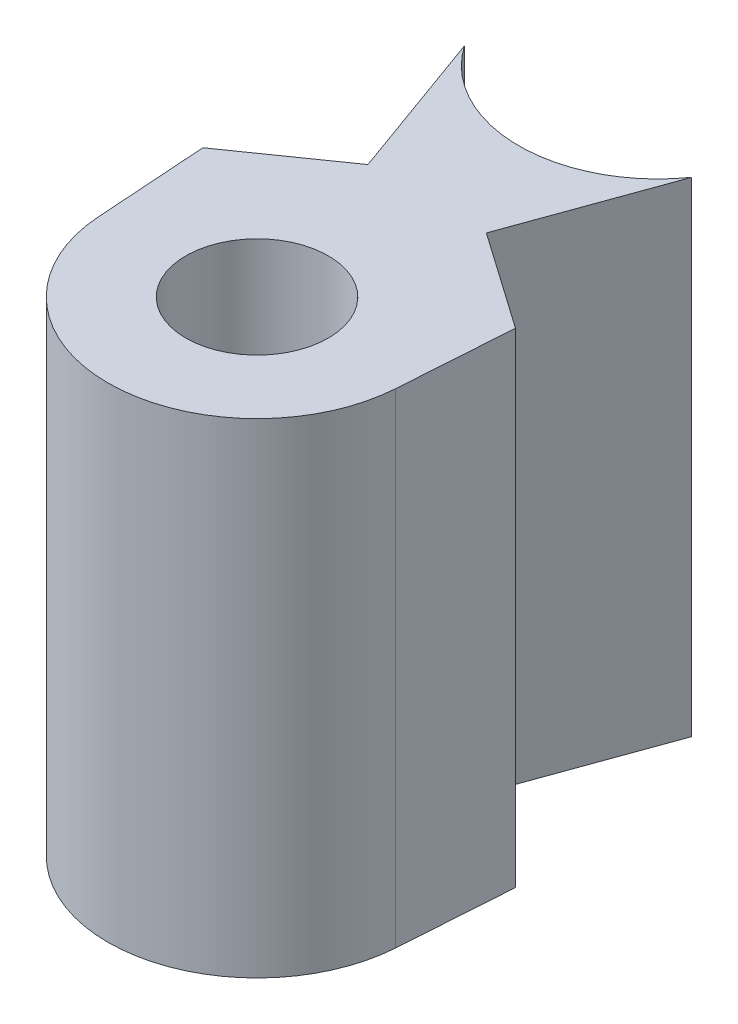
ISO-10303-21;
HEADER;
FILE_DESCRIPTION(('STEP AP214'),'2;1');
FILE_NAME('part.step','',(''),(''),'','','');
FILE_SCHEMA(('AUTOMOTIVE_DESIGN { 1 0 10303 214 1 1 1 1 }'));
ENDSEC;
DATA;
#1=APPLICATION_CONTEXT('core data for automotive mechanical design processes');
#2=APPLICATION_PROTOCOL_DEFINITION('international standard','automotive_design',2000,#1);
#3=PRODUCT_CONTEXT('',#1,'mechanical');
#4=PRODUCT('Part','Part','',(#3));
#5=PRODUCT_RELATED_PRODUCT_CATEGORY('part','',(#4));
#6=PRODUCT_DEFINITION_FORMATION('','',#4);
#7=PRODUCT_DEFINITION_CONTEXT('part definition',#1,'design');
#8=PRODUCT_DEFINITION('design','',#6,#7);
#9=PRODUCT_DEFINITION_SHAPE('','',#8);
#10=(LENGTH_UNIT() NAMED_UNIT(*) SI_UNIT(.MILLI.,.METRE.));
#11=(NAMED_UNIT(*) PLANE_ANGLE_UNIT() SI_UNIT($,.RADIAN.));
#12=(NAMED_UNIT(*) SI_UNIT($,.STERADIAN.) SOLID_ANGLE_UNIT());
#13=UNCERTAINTY_MEASURE_WITH_UNIT(LENGTH_MEASURE(1.E-05),#10,'distance_accuracy_value','');
#14=(GEOMETRIC_REPRESENTATION_CONTEXT(3) GLOBAL_UNCERTAINTY_ASSIGNED_CONTEXT((#13)) GLOBAL_UNIT_ASSIGNED_CONTEXT((#10,
#11,#12)) REPRESENTATION_CONTEXT('',''));
#15=CARTESIAN_POINT('',(0.,0.,0.));
#16=DIRECTION('',(0.,0.,1.));
#17=DIRECTION('',(1.,0.,0.));
#18=AXIS2_PLACEMENT_3D('',#15,#16,#17);
#19=CARTESIAN_POINT('',(0.,1.75,0.));
#20=DIRECTION('',(-0.573576436351044,0.,0.819152044288993));
#21=DIRECTION('',(0.819152044288993,0.,0.573576436351044));
#22=AXIS2_PLACEMENT_3D('',#19,#20,#21);
#23=PLANE('',#22);
#24=DIRECTION('',(0.,-1.,0.));
#25=VECTOR('',#24,1.);
#26=CARTESIAN_POINT('',(0.6102682729953,1.75,0.427314445081528));
#27=LINE('',#26,#25);
#28=CARTESIAN_POINT('',(0.6102682729953,1.75,0.427314445081528));
#29=VERTEX_POINT('',#28);
#30=CARTESIAN_POINT('',(0.6102682729953,0.85,0.427314445081528));
#31=VERTEX_POINT('',#30);
#32=EDGE_CURVE('E44',#29,#31,#27,.T.);
#33=ORIENTED_EDGE('',*,*,#32,.T.);
#34=DIRECTION('',(-0.819152044288993,0.,-0.573576436351044));
#35=VECTOR('',#34,1.);
#36=CARTESIAN_POINT('',(0.,0.85,0.));
#37=LINE('',#36,#35);
#38=CARTESIAN_POINT('',(0.479203945909061,0.85,0.335542215265361));
#39=VERTEX_POINT('',#38);
#40=EDGE_CURVE('E154',#31,#39,#37,.T.);
#41=ORIENTED_EDGE('',*,*,#40,.T.);
#42=DIRECTION('',(0.,-1.,0.));
#43=VECTOR('',#42,1.);
#44=CARTESIAN_POINT('',(0.479203945909061,1.75,0.335542215265361));
#45=LINE('',#44,#43);
#46=CARTESIAN_POINT('',(0.479203945909061,1.75,0.335542215265361));
#47=VERTEX_POINT('',#46);
#48=EDGE_CURVE('E11',#47,#39,#45,.T.);
#49=ORIENTED_EDGE('',*,*,#48,.F.);
#50=DIRECTION('',(-0.819152044288993,0.,-0.573576436351044));
#51=VECTOR('',#50,1.);
#52=CARTESIAN_POINT('',(0.,1.75,0.));
#53=LINE('',#52,#51);
#54=EDGE_CURVE('E170',#29,#47,#53,.T.);
#55=ORIENTED_EDGE('',*,*,#54,.F.);
#56=EDGE_LOOP('',(#33,#41,#49,#55));
#57=FACE_BOUND('',#56,.T.);
#58=ADVANCED_FACE('F41',(#57),#23,.F.);
#59=CARTESIAN_POINT('',(0.,1.75,0.));
#60=DIRECTION('',(0.,-1.,0.));
#61=DIRECTION('',(0.,0.,-1.));
#62=AXIS2_PLACEMENT_3D('',#59,#60,#61);
#63=CYLINDRICAL_SURFACE('',#62,0.585);
#64=ORIENTED_EDGE('',*,*,#48,.T.);
#65=CARTESIAN_POINT('',(0.,0.85,0.));
#66=DIRECTION('',(0.,-1.,0.));
#67=DIRECTION('',(0.,0.,-1.));
#68=AXIS2_PLACEMENT_3D('',#65,#66,#67);
#69=CIRCLE('',#68,0.585);
#70=CARTESIAN_POINT('',(-0.479203945909061,0.85,0.335542215265361));
#71=VERTEX_POINT('',#70);
#72=EDGE_CURVE('E167',#39,#71,#69,.T.);
#73=ORIENTED_EDGE('',*,*,#72,.T.);
#74=DIRECTION('',(0.,-1.,0.));
#75=VECTOR('',#74,1.);
#76=CARTESIAN_POINT('',(-0.479203945909061,1.75,0.335542215265361));
#77=LINE('',#76,#75);
#78=CARTESIAN_POINT('',(-0.479203945909061,1.75,0.335542215265361));
#79=VERTEX_POINT('',#78);
#80=EDGE_CURVE('E49',#79,#71,#77,.T.);
#81=ORIENTED_EDGE('',*,*,#80,.F.);
#82=CARTESIAN_POINT('',(0.,1.75,0.));
#83=DIRECTION('',(0.,-1.,0.));
#84=DIRECTION('',(0.,0.,-1.));
#85=AXIS2_PLACEMENT_3D('',#82,#83,#84);
#86=CIRCLE('',#85,0.585);
#87=EDGE_CURVE('E56',#47,#79,#86,.T.);
#88=ORIENTED_EDGE('',*,*,#87,.F.);
#89=EDGE_LOOP('',(#64,#73,#81,#88));
#90=FACE_BOUND('',#89,.T.);
#91=ADVANCED_FACE('F276',(#90),#63,.F.);
#92=CARTESIAN_POINT('',(0.,1.75,0.));
#93=DIRECTION('',(0.573576436351044,0.,0.819152044288993));
#94=DIRECTION('',(0.819152044288993,0.,-0.573576436351044));
#95=AXIS2_PLACEMENT_3D('',#92,#93,#94);
#96=PLANE('',#95);
#97=ORIENTED_EDGE('',*,*,#80,.T.);
#98=DIRECTION('',(-0.819152044288993,0.,0.573576436351044));
#99=VECTOR('',#98,1.);
#100=CARTESIAN_POINT('',(0.,0.85,0.));
#101=LINE('',#100,#99);
#102=CARTESIAN_POINT('',(-0.6102682729953,0.85,0.427314445081528));
#103=VERTEX_POINT('',#102);
#104=EDGE_CURVE('E164',#71,#103,#101,.T.);
#105=ORIENTED_EDGE('',*,*,#104,.T.);
#106=DIRECTION('',(0.,-1.,0.));
#107=VECTOR('',#106,1.);
#108=CARTESIAN_POINT('',(-0.6102682729953,1.75,0.427314445081528));
#109=LINE('',#108,#107);
#110=CARTESIAN_POINT('',(-0.6102682729953,1.75,0.427314445081528));
#111=VERTEX_POINT('',#110);
#112=EDGE_CURVE('E178',#111,#103,#109,.T.);
#113=ORIENTED_EDGE('',*,*,#112,.F.);
#114=DIRECTION('',(-0.819152044288993,0.,0.573576436351044));
#115=VECTOR('',#114,1.);
#116=CARTESIAN_POINT('',(0.,1.75,0.));
#117=LINE('',#116,#115);
#118=EDGE_CURVE('E175',#79,#111,#117,.T.);
#119=ORIENTED_EDGE('',*,*,#118,.F.);
#120=EDGE_LOOP('',(#97,#105,#113,#119));
#121=FACE_BOUND('',#120,.T.);
#122=ADVANCED_FACE('F280',(#121),#96,.F.);
#123=CARTESIAN_POINT('',(0.,1.75,0.));
#124=DIRECTION('',(0.,-1.,0.));
#125=DIRECTION('',(0.,0.,-1.));
#126=AXIS2_PLACEMENT_3D('',#123,#124,#125);
#127=PLANE('',#126);
#128=ORIENTED_EDGE('',*,*,#54,.T.);
#129=ORIENTED_EDGE('',*,*,#87,.T.);
#130=ORIENTED_EDGE('',*,*,#118,.T.);
#131=CARTESIAN_POINT('',(0.,1.75,0.));
#132=DIRECTION('',(0.,-1.,0.));
#133=DIRECTION('',(0.,0.,-1.));
#134=AXIS2_PLACEMENT_3D('',#131,#132,#133);
#135=CIRCLE('',#134,0.745);
#136=EDGE_CURVE('E172',#29,#111,#135,.T.);
#137=ORIENTED_EDGE('',*,*,#136,.F.);
#138=EDGE_LOOP('',(#128,#129,#130,#137));
#139=FACE_BOUND('',#138,.T.);
#140=ADVANCED_FACE('F285',(#139),#127,.F.);
#141=CARTESIAN_POINT('',(0.,0.85,0.));
#142=DIRECTION('',(0.,-1.,0.));
#143=DIRECTION('',(0.,0.,-1.));
#144=AXIS2_PLACEMENT_3D('',#141,#142,#143);
#145=PLANE('',#144);
#146=ORIENTED_EDGE('',*,*,#40,.F.);
#147=CARTESIAN_POINT('',(0.,0.85,0.));
#148=DIRECTION('',(0.,-1.,0.));
#149=DIRECTION('',(0.,0.,-1.));
#150=AXIS2_PLACEMENT_3D('',#147,#148,#149);
#151=CIRCLE('',#150,0.745);
#152=EDGE_CURVE('E157',#31,#103,#151,.T.);
#153=ORIENTED_EDGE('',*,*,#152,.T.);
#154=ORIENTED_EDGE('',*,*,#104,.F.);
#155=ORIENTED_EDGE('',*,*,#72,.F.);
#156=EDGE_LOOP('',(#146,#153,#154,#155));
#157=FACE_BOUND('',#156,.T.);
#158=ADVANCED_FACE('F193',(#157),#145,.T.);
#159=CARTESIAN_POINT('',(0.,2.6,0.));
#160=DIRECTION('',(0.,-1.,0.));
#161=DIRECTION('',(0.,0.,-1.));
#162=AXIS2_PLACEMENT_3D('',#159,#160,#161);
#163=CYLINDRICAL_SURFACE('',#162,0.745);
#164=ORIENTED_EDGE('',*,*,#152,.F.);
#165=DIRECTION('',(0.,-1.,0.));
#166=VECTOR('',#165,1.);
#167=CARTESIAN_POINT('',(0.6102682729953,2.6,0.427314445081528));
#168=LINE('',#167,#166);
#169=CARTESIAN_POINT('',(0.6102682729953,0.,0.427314445081528));
#170=VERTEX_POINT('',#169);
#171=EDGE_CURVE('E199',#31,#170,#168,.T.);
#172=ORIENTED_EDGE('',*,*,#171,.T.);
#173=CARTESIAN_POINT('',(0.,0.,0.));
#174=DIRECTION('',(0.,1.,0.));
#175=DIRECTION('',(0.,0.,1.));
#176=AXIS2_PLACEMENT_3D('',#173,#174,#175);
#177=CIRCLE('',#176,0.745);
#178=CARTESIAN_POINT('',(-0.6102682729953,0.,0.427314445081528));
#179=VERTEX_POINT('',#178);
#180=EDGE_CURVE('E231',#179,#170,#177,.T.);
#181=ORIENTED_EDGE('',*,*,#180,.F.);
#182=DIRECTION('',(0.,-1.,0.));
#183=VECTOR('',#182,1.);
#184=CARTESIAN_POINT('',(-0.6102682729953,2.6,0.427314445081528));
#185=LINE('',#184,#183);
#186=EDGE_CURVE('E201',#103,#179,#185,.T.);
#187=ORIENTED_EDGE('',*,*,#186,.F.);
#188=EDGE_LOOP('',(#164,#172,#181,#187));
#189=FACE_BOUND('',#188,.T.);
#190=ADVANCED_FACE('F197',(#189),#163,.F.);
#191=CARTESIAN_POINT('',(-0.942848429511865,2.6,0.0637325581395349));
#192=DIRECTION('',(0.997723205832662,0.,-0.0674418604651163));
#193=DIRECTION('',(-0.0674418604651162,0.,-0.997723205832662));
#194=AXIS2_PLACEMENT_3D('',#191,#192,#193);
#195=PLANE('',#194);
#196=DIRECTION('',(0.0674418604651163,0.,0.997723205832662));
#197=VECTOR('',#196,1.);
#198=CARTESIAN_POINT('',(-0.942848429511865,0.,0.0637325581395349));
#199=LINE('',#198,#197);
#200=CARTESIAN_POINT('',(-0.838876724693396,0.,1.60187195601434));
#201=VERTEX_POINT('',#200);
#202=CARTESIAN_POINT('',(-0.79817856466613,0.,2.20395348837209));
#203=VERTEX_POINT('',#202);
#204=EDGE_CURVE('E153',#201,#203,#199,.T.);
#205=ORIENTED_EDGE('',*,*,#204,.T.);
#206=DIRECTION('',(0.,-1.,0.));
#207=VECTOR('',#206,1.);
#208=CARTESIAN_POINT('',(-0.79817856466613,2.6,2.20395348837209));
#209=LINE('',#208,#207);
#210=CARTESIAN_POINT('',(-0.79817856466613,2.6,2.20395348837209));
#211=VERTEX_POINT('',#210);
#212=EDGE_CURVE('E133',#211,#203,#209,.T.);
#213=ORIENTED_EDGE('',*,*,#212,.F.);
#214=DIRECTION('',(0.0674418604651163,0.,0.997723205832662));
#215=VECTOR('',#214,1.);
#216=CARTESIAN_POINT('',(-0.942848429511865,2.6,0.0637325581395349));
#217=LINE('',#216,#215);
#218=CARTESIAN_POINT('',(-0.838876724693396,2.6,1.60187195601434));
#219=VERTEX_POINT('',#218);
#220=EDGE_CURVE('E140',#219,#211,#217,.T.);
#221=ORIENTED_EDGE('',*,*,#220,.F.);
#222=DIRECTION('',(0.,-1.,0.));
#223=VECTOR('',#222,1.);
#224=CARTESIAN_POINT('',(-0.838876724693396,2.6,1.60187195601434));
#225=LINE('',#224,#223);
#226=EDGE_CURVE('E240',#219,#201,#225,.T.);
#227=ORIENTED_EDGE('',*,*,#226,.T.);
#228=EDGE_LOOP('',(#205,#213,#221,#227));
#229=FACE_BOUND('',#228,.T.);
#230=ADVANCED_FACE('F151',(#229),#195,.F.);
#231=CARTESIAN_POINT('',(0.,2.6,2.15));
#232=DIRECTION('',(0.,-1.,0.));
#233=DIRECTION('',(0.,0.,-1.));
#234=AXIS2_PLACEMENT_3D('',#231,#232,#233);
#235=CYLINDRICAL_SURFACE('',#234,0.8);
#236=CARTESIAN_POINT('',(0.,0.,2.15));
#237=DIRECTION('',(0.,1.,0.));
#238=DIRECTION('',(0.,0.,1.));
#239=AXIS2_PLACEMENT_3D('',#236,#237,#238);
#240=CIRCLE('',#239,0.8);
#241=CARTESIAN_POINT('',(0.79817856466613,0.,2.20395348837209));
#242=VERTEX_POINT('',#241);
#243=EDGE_CURVE('E227',#203,#242,#240,.T.);
#244=ORIENTED_EDGE('',*,*,#243,.T.);
#245=DIRECTION('',(0.,-1.,0.));
#246=VECTOR('',#245,1.);
#247=CARTESIAN_POINT('',(0.79817856466613,2.6,2.20395348837209));
#248=LINE('',#247,#246);
#249=CARTESIAN_POINT('',(0.79817856466613,2.6,2.20395348837209));
#250=VERTEX_POINT('',#249);
#251=EDGE_CURVE('E135',#250,#242,#248,.T.);
#252=ORIENTED_EDGE('',*,*,#251,.F.);
#253=CARTESIAN_POINT('',(0.,2.6,2.15));
#254=DIRECTION('',(0.,1.,0.));
#255=DIRECTION('',(0.,0.,1.));
#256=AXIS2_PLACEMENT_3D('',#253,#254,#255);
#257=CIRCLE('',#256,0.8);
#258=EDGE_CURVE('E128',#211,#250,#257,.T.);
#259=ORIENTED_EDGE('',*,*,#258,.F.);
#260=ORIENTED_EDGE('',*,*,#212,.T.);
#261=EDGE_LOOP('',(#244,#252,#259,#260));
#262=FACE_BOUND('',#261,.T.);
#263=ADVANCED_FACE('F131',(#262),#235,.T.);
#264=CARTESIAN_POINT('',(0.942848429511865,2.6,0.0637325581395349));
#265=DIRECTION('',(0.997723205832662,0.,0.0674418604651163));
#266=DIRECTION('',(0.0674418604651162,0.,-0.997723205832662));
#267=AXIS2_PLACEMENT_3D('',#264,#265,#266);
#268=PLANE('',#267);
#269=DIRECTION('',(-0.0674418604651163,0.,0.997723205832662));
#270=VECTOR('',#269,1.);
#271=CARTESIAN_POINT('',(0.942848429511865,0.,0.0637325581395349));
#272=LINE('',#271,#270);
#273=CARTESIAN_POINT('',(0.838876724693396,0.,1.60187195601434));
#274=VERTEX_POINT('',#273);
#275=EDGE_CURVE('E224',#274,#242,#272,.T.);
#276=ORIENTED_EDGE('',*,*,#275,.F.);
#277=DIRECTION('',(0.,-1.,0.));
#278=VECTOR('',#277,1.);
#279=CARTESIAN_POINT('',(0.838876724693396,2.6,1.60187195601434));
#280=LINE('',#279,#278);
#281=CARTESIAN_POINT('',(0.838876724693396,2.6,1.60187195601434));
#282=VERTEX_POINT('',#281);
#283=EDGE_CURVE('E159',#282,#274,#280,.T.);
#284=ORIENTED_EDGE('',*,*,#283,.F.);
#285=DIRECTION('',(-0.0674418604651163,0.,0.997723205832662));
#286=VECTOR('',#285,1.);
#287=CARTESIAN_POINT('',(0.942848429511865,2.6,0.0637325581395349));
#288=LINE('',#287,#286);
#289=EDGE_CURVE('E139',#282,#250,#288,.T.);
#290=ORIENTED_EDGE('',*,*,#289,.T.);
#291=ORIENTED_EDGE('',*,*,#251,.T.);
#292=EDGE_LOOP('',(#276,#284,#290,#291));
#293=FACE_BOUND('',#292,.T.);
#294=ADVANCED_FACE('F225',(#293),#268,.T.);
#295=CARTESIAN_POINT('',(-0.476651634714688,2.6,0.680729082028155));
#296=DIRECTION('',(0.573576436351044,0.,-0.819152044288993));
#297=DIRECTION('',(-0.819152044288993,0.,-0.573576436351044));
#298=AXIS2_PLACEMENT_3D('',#295,#296,#297);
#299=PLANE('',#298);
#300=DIRECTION('',(0.819152044288993,0.,0.573576436351044));
#301=VECTOR('',#300,1.);
#302=CARTESIAN_POINT('',(-0.476651634714688,0.,0.680729082028155));
#303=LINE('',#302,#301);
#304=CARTESIAN_POINT('',(0.317859347068842,0.,1.23705166066338));
#305=VERTEX_POINT('',#304);
#306=EDGE_CURVE('E219',#305,#274,#303,.T.);
#307=ORIENTED_EDGE('',*,*,#306,.F.);
#308=DIRECTION('',(0.,-1.,0.));
#309=VECTOR('',#308,1.);
#310=CARTESIAN_POINT('',(0.317859347068842,2.6,1.23705166066338));
#311=LINE('',#310,#309);
#312=CARTESIAN_POINT('',(0.317859347068842,2.6,1.23705166066338));
#313=VERTEX_POINT('',#312);
#314=EDGE_CURVE('E209',#313,#305,#311,.T.);
#315=ORIENTED_EDGE('',*,*,#314,.F.);
#316=DIRECTION('',(0.819152044288993,0.,0.573576436351044));
#317=VECTOR('',#316,1.);
#318=CARTESIAN_POINT('',(-0.476651634714688,2.6,0.680729082028155));
#319=LINE('',#318,#317);
#320=EDGE_CURVE('E221',#313,#282,#319,.T.);
#321=ORIENTED_EDGE('',*,*,#320,.T.);
#322=ORIENTED_EDGE('',*,*,#283,.T.);
#323=EDGE_LOOP('',(#307,#315,#321,#322));
#324=FACE_BOUND('',#323,.T.);
#325=ADVANCED_FACE('F217',(#324),#299,.T.);
#326=CARTESIAN_POINT('',(0.676375746077062,2.6,0.244249988301432));
#327=DIRECTION('',(0.94055248211324,0.,0.339648389353789));
#328=DIRECTION('',(0.339648389353789,0.,-0.94055248211324));
#329=AXIS2_PLACEMENT_3D('',#326,#327,#328);
#330=PLANE('',#329);
#331=DIRECTION('',(-0.339648389353789,0.,0.94055248211324));
#332=VECTOR('',#331,1.);
#333=CARTESIAN_POINT('',(0.676375746077062,0.,0.244249988301432));
#334=LINE('',#333,#332);
#335=EDGE_CURVE('E204',#170,#305,#334,.T.);
#336=ORIENTED_EDGE('',*,*,#335,.F.);
#337=ORIENTED_EDGE('',*,*,#171,.F.);
#338=ORIENTED_EDGE('',*,*,#32,.F.);
#339=CARTESIAN_POINT('',(0.6102682729953,2.6,0.427314445081528));
#340=VERTEX_POINT('',#339);
#341=EDGE_CURVE('E206',#340,#29,#168,.T.);
#342=ORIENTED_EDGE('',*,*,#341,.F.);
#343=DIRECTION('',(-0.339648389353789,0.,0.94055248211324));
#344=VECTOR('',#343,1.);
#345=CARTESIAN_POINT('',(0.676375746077062,2.6,0.244249988301432));
#346=LINE('',#345,#344);
#347=EDGE_CURVE('E307',#340,#313,#346,.T.);
#348=ORIENTED_EDGE('',*,*,#347,.T.);
#349=ORIENTED_EDGE('',*,*,#314,.T.);
#350=EDGE_LOOP('',(#336,#337,#338,#342,#348,#349));
#351=FACE_BOUND('',#350,.T.);
#352=ADVANCED_FACE('F202',(#351),#330,.T.);
#353=ORIENTED_EDGE('',*,*,#341,.T.);
#354=ORIENTED_EDGE('',*,*,#136,.T.);
#355=CARTESIAN_POINT('',(-0.6102682729953,2.6,0.427314445081528));
#356=VERTEX_POINT('',#355);
#357=EDGE_CURVE('E207',#356,#111,#185,.T.);
#358=ORIENTED_EDGE('',*,*,#357,.F.);
#359=CARTESIAN_POINT('',(0.,2.6,0.));
#360=DIRECTION('',(0.,1.,0.));
#361=DIRECTION('',(0.,0.,1.));
#362=AXIS2_PLACEMENT_3D('',#359,#360,#361);
#363=CIRCLE('',#362,0.745);
#364=EDGE_CURVE('E251',#356,#340,#363,.T.);
#365=ORIENTED_EDGE('',*,*,#364,.T.);
#366=EDGE_LOOP('',(#353,#354,#358,#365));
#367=FACE_BOUND('',#366,.T.);
#368=ADVANCED_FACE('F270',(#367),#163,.F.);
#369=CARTESIAN_POINT('',(-0.676375746077062,2.6,0.244249988301432));
#370=DIRECTION('',(0.94055248211324,0.,-0.339648389353789));
#371=DIRECTION('',(-0.339648389353789,0.,-0.94055248211324));
#372=AXIS2_PLACEMENT_3D('',#369,#370,#371);
#373=PLANE('',#372);
#374=DIRECTION('',(0.339648389353789,0.,0.94055248211324));
#375=VECTOR('',#374,1.);
#376=CARTESIAN_POINT('',(-0.676375746077062,0.,0.244249988301432));
#377=LINE('',#376,#375);
#378=CARTESIAN_POINT('',(-0.317859347068842,0.,1.23705166066338));
#379=VERTEX_POINT('',#378);
#380=EDGE_CURVE('E236',#179,#379,#377,.T.);
#381=ORIENTED_EDGE('',*,*,#380,.T.);
#382=DIRECTION('',(0.,-1.,0.));
#383=VECTOR('',#382,1.);
#384=CARTESIAN_POINT('',(-0.317859347068842,2.6,1.23705166066338));
#385=LINE('',#384,#383);
#386=CARTESIAN_POINT('',(-0.317859347068842,2.6,1.23705166066338));
#387=VERTEX_POINT('',#386);
#388=EDGE_CURVE('E241',#387,#379,#385,.T.);
#389=ORIENTED_EDGE('',*,*,#388,.F.);
#390=DIRECTION('',(0.339648389353789,0.,0.94055248211324));
#391=VECTOR('',#390,1.);
#392=CARTESIAN_POINT('',(-0.676375746077062,2.6,0.244249988301432));
#393=LINE('',#392,#391);
#394=EDGE_CURVE('E249',#356,#387,#393,.T.);
#395=ORIENTED_EDGE('',*,*,#394,.F.);
#396=ORIENTED_EDGE('',*,*,#357,.T.);
#397=ORIENTED_EDGE('',*,*,#112,.T.);
#398=ORIENTED_EDGE('',*,*,#186,.T.);
#399=EDGE_LOOP('',(#381,#389,#395,#396,#397,#398));
#400=FACE_BOUND('',#399,.T.);
#401=ADVANCED_FACE('F247',(#400),#373,.F.);
#402=CARTESIAN_POINT('',(0.,2.6,2.15));
#403=DIRECTION('',(0.,-1.,0.));
#404=DIRECTION('',(0.,0.,-1.));
#405=AXIS2_PLACEMENT_3D('',#402,#403,#404);
#406=CYLINDRICAL_SURFACE('',#405,0.3825);
#407=CARTESIAN_POINT('',(0.,2.6,2.15));
#408=DIRECTION('',(0.,1.,0.));
#409=DIRECTION('',(0.,0.,1.));
#410=AXIS2_PLACEMENT_3D('',#407,#408,#409);
#411=CIRCLE('',#410,0.3825);
#412=CARTESIAN_POINT('',(0.,2.6,2.5325));
#413=VERTEX_POINT('',#412);
#414=EDGE_CURVE('E149',#413,#413,#411,.T.);
#415=ORIENTED_EDGE('',*,*,#414,.T.);
#416=EDGE_LOOP('',(#415));
#417=FACE_BOUND('',#416,.T.);
#418=CARTESIAN_POINT('',(0.,0.,2.15));
#419=DIRECTION('',(0.,1.,0.));
#420=DIRECTION('',(0.,0.,1.));
#421=AXIS2_PLACEMENT_3D('',#418,#419,#420);
#422=CIRCLE('',#421,0.3825);
#423=CARTESIAN_POINT('',(0.,0.,2.5325));
#424=VERTEX_POINT('',#423);
#425=EDGE_CURVE('E255',#424,#424,#422,.T.);
#426=ORIENTED_EDGE('',*,*,#425,.F.);
#427=EDGE_LOOP('',(#426));
#428=FACE_BOUND('',#427,.T.);
#429=ADVANCED_FACE('F261',(#417,#428),#406,.F.);
#430=CARTESIAN_POINT('',(0.476651634714688,2.6,0.680729082028155));
#431=DIRECTION('',(0.573576436351044,0.,0.819152044288993));
#432=DIRECTION('',(0.819152044288993,0.,-0.573576436351044));
#433=AXIS2_PLACEMENT_3D('',#430,#431,#432);
#434=PLANE('',#433);
#435=DIRECTION('',(-0.819152044288993,0.,0.573576436351044));
#436=VECTOR('',#435,1.);
#437=CARTESIAN_POINT('',(0.476651634714688,0.,0.680729082028155));
#438=LINE('',#437,#436);
#439=EDGE_CURVE('E238',#379,#201,#438,.T.);
#440=ORIENTED_EDGE('',*,*,#439,.T.);
#441=ORIENTED_EDGE('',*,*,#226,.F.);
#442=DIRECTION('',(-0.819152044288993,0.,0.573576436351044));
#443=VECTOR('',#442,1.);
#444=CARTESIAN_POINT('',(0.476651634714688,2.6,0.680729082028155));
#445=LINE('',#444,#443);
#446=EDGE_CURVE('E145',#387,#219,#445,.T.);
#447=ORIENTED_EDGE('',*,*,#446,.F.);
#448=ORIENTED_EDGE('',*,*,#388,.T.);
#449=EDGE_LOOP('',(#440,#441,#447,#448));
#450=FACE_BOUND('',#449,.T.);
#451=ADVANCED_FACE('F248',(#450),#434,.F.);
#452=CARTESIAN_POINT('',(0.,2.6,0.));
#453=DIRECTION('',(0.,1.,0.));
#454=DIRECTION('',(0.,0.,1.));
#455=AXIS2_PLACEMENT_3D('',#452,#453,#454);
#456=PLANE('',#455);
#457=ORIENTED_EDGE('',*,*,#414,.F.);
#458=EDGE_LOOP('',(#457));
#459=FACE_BOUND('',#458,.T.);
#460=ORIENTED_EDGE('',*,*,#220,.T.);
#461=ORIENTED_EDGE('',*,*,#258,.T.);
#462=ORIENTED_EDGE('',*,*,#289,.F.);
#463=ORIENTED_EDGE('',*,*,#320,.F.);
#464=ORIENTED_EDGE('',*,*,#347,.F.);
#465=ORIENTED_EDGE('',*,*,#364,.F.);
#466=ORIENTED_EDGE('',*,*,#394,.T.);
#467=ORIENTED_EDGE('',*,*,#446,.T.);
#468=EDGE_LOOP('',(#460,#461,#462,#463,#464,#465,#466,#467));
#469=FACE_BOUND('',#468,.T.);
#470=ADVANCED_FACE('F143',(#459,#469),#456,.T.);
#471=CARTESIAN_POINT('',(0.,0.,0.));
#472=DIRECTION('',(0.,1.,0.));
#473=DIRECTION('',(0.,0.,1.));
#474=AXIS2_PLACEMENT_3D('',#471,#472,#473);
#475=PLANE('',#474);
#476=ORIENTED_EDGE('',*,*,#425,.T.);
#477=EDGE_LOOP('',(#476));
#478=FACE_BOUND('',#477,.T.);
#479=ORIENTED_EDGE('',*,*,#204,.F.);
#480=ORIENTED_EDGE('',*,*,#439,.F.);
#481=ORIENTED_EDGE('',*,*,#380,.F.);
#482=ORIENTED_EDGE('',*,*,#180,.T.);
#483=ORIENTED_EDGE('',*,*,#335,.T.);
#484=ORIENTED_EDGE('',*,*,#306,.T.);
#485=ORIENTED_EDGE('',*,*,#275,.T.);
#486=ORIENTED_EDGE('',*,*,#243,.F.);
#487=EDGE_LOOP('',(#479,#480,#481,#482,#483,#484,#485,#486));
#488=FACE_BOUND('',#487,.T.);
#489=ADVANCED_FACE('F229',(#478,#488),#475,.F.);
#490=CLOSED_SHELL('',(#58,#91,#122,#140,#158,#190,#230,#263,#294,#325,#352,#368,#401,#429,#451,
#470,#489));
#491=MANIFOLD_SOLID_BREP('B2',#490);
#492=ADVANCED_BREP_SHAPE_REPRESENTATION('',(#18,#491),#14);
#493=SHAPE_DEFINITION_REPRESENTATION(#9,#492);
ENDSEC;
END-ISO-10303-21;
